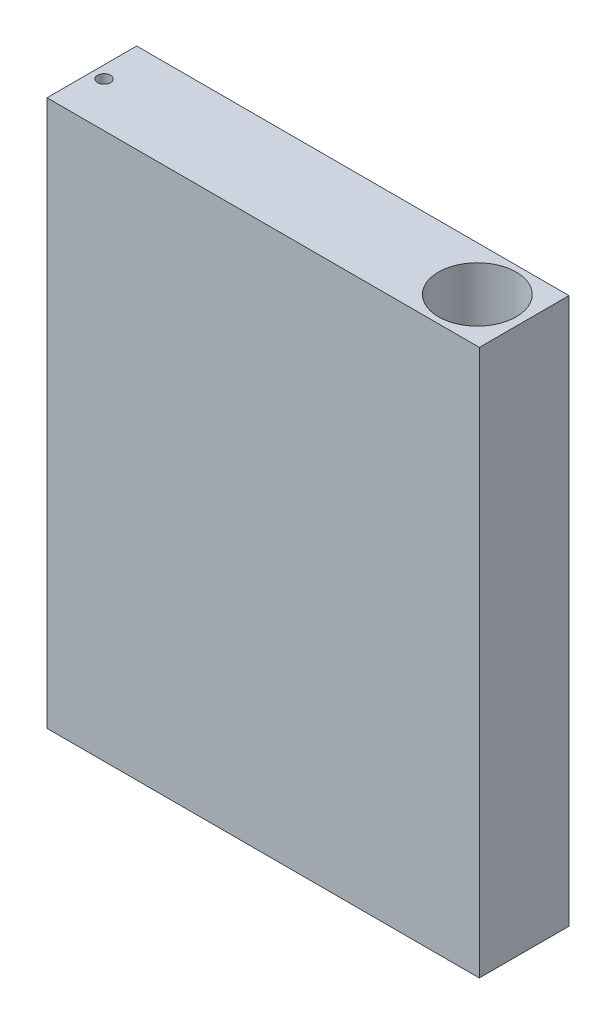
ISO-10303-21;
HEADER;
FILE_DESCRIPTION(('STEP AP214'),'2;1');
FILE_NAME('part.step','',(''),(''),'','','');
FILE_SCHEMA(('AUTOMOTIVE_DESIGN { 1 0 10303 214 1 1 1 1 }'));
ENDSEC;
DATA;
#1=APPLICATION_CONTEXT('core data for automotive mechanical design processes');
#2=APPLICATION_PROTOCOL_DEFINITION('international standard','automotive_design',2000,#1);
#3=PRODUCT_CONTEXT('',#1,'mechanical');
#4=PRODUCT('Part','Part','',(#3));
#5=PRODUCT_RELATED_PRODUCT_CATEGORY('part','',(#4));
#6=PRODUCT_DEFINITION_FORMATION('','',#4);
#7=PRODUCT_DEFINITION_CONTEXT('part definition',#1,'design');
#8=PRODUCT_DEFINITION('design','',#6,#7);
#9=PRODUCT_DEFINITION_SHAPE('','',#8);
#10=(LENGTH_UNIT() NAMED_UNIT(*) SI_UNIT(.MILLI.,.METRE.));
#11=(NAMED_UNIT(*) PLANE_ANGLE_UNIT() SI_UNIT($,.RADIAN.));
#12=(NAMED_UNIT(*) SI_UNIT($,.STERADIAN.) SOLID_ANGLE_UNIT());
#13=UNCERTAINTY_MEASURE_WITH_UNIT(LENGTH_MEASURE(1.E-05),#10,'distance_accuracy_value','');
#14=(GEOMETRIC_REPRESENTATION_CONTEXT(3) GLOBAL_UNCERTAINTY_ASSIGNED_CONTEXT((#13)) GLOBAL_UNIT_ASSIGNED_CONTEXT((#10,
#11,#12)) REPRESENTATION_CONTEXT('',''));
#15=CARTESIAN_POINT('',(0.,0.,0.));
#16=DIRECTION('',(0.,0.,1.));
#17=DIRECTION('',(1.,0.,0.));
#18=AXIS2_PLACEMENT_3D('',#15,#16,#17);
#19=CARTESIAN_POINT('',(0.,67.,0.));
#20=DIRECTION('',(1.,0.,0.));
#21=DIRECTION('',(0.,0.,-1.));
#22=AXIS2_PLACEMENT_3D('',#19,#20,#21);
#23=PLANE('',#22);
#24=DIRECTION('',(0.,0.,1.));
#25=VECTOR('',#24,1.);
#26=CARTESIAN_POINT('',(0.,0.,0.));
#27=LINE('',#26,#25);
#28=CARTESIAN_POINT('',(0.,0.,-11.));
#29=VERTEX_POINT('',#28);
#30=CARTESIAN_POINT('',(0.,0.,0.));
#31=VERTEX_POINT('',#30);
#32=EDGE_CURVE('E97',#29,#31,#27,.T.);
#33=ORIENTED_EDGE('',*,*,#32,.T.);
#34=DIRECTION('',(0.,-1.,0.));
#35=VECTOR('',#34,1.);
#36=CARTESIAN_POINT('',(0.,67.,0.));
#37=LINE('',#36,#35);
#38=CARTESIAN_POINT('',(0.,67.,0.));
#39=VERTEX_POINT('',#38);
#40=EDGE_CURVE('E11',#39,#31,#37,.T.);
#41=ORIENTED_EDGE('',*,*,#40,.F.);
#42=DIRECTION('',(0.,0.,1.));
#43=VECTOR('',#42,1.);
#44=CARTESIAN_POINT('',(0.,67.,0.));
#45=LINE('',#44,#43);
#46=CARTESIAN_POINT('',(0.,67.,-11.));
#47=VERTEX_POINT('',#46);
#48=EDGE_CURVE('E85',#47,#39,#45,.T.);
#49=ORIENTED_EDGE('',*,*,#48,.F.);
#50=DIRECTION('',(0.,-1.,0.));
#51=VECTOR('',#50,1.);
#52=CARTESIAN_POINT('',(0.,67.,-11.));
#53=LINE('',#52,#51);
#54=EDGE_CURVE('E93',#47,#29,#53,.T.);
#55=ORIENTED_EDGE('',*,*,#54,.T.);
#56=EDGE_LOOP('',(#33,#41,#49,#55));
#57=FACE_BOUND('',#56,.T.);
#58=ADVANCED_FACE('F34',(#57),#23,.F.);
#59=CARTESIAN_POINT('',(0.,67.,0.));
#60=DIRECTION('',(0.,0.,-1.));
#61=DIRECTION('',(-1.,0.,0.));
#62=AXIS2_PLACEMENT_3D('',#59,#60,#61);
#63=PLANE('',#62);
#64=DIRECTION('',(1.,0.,0.));
#65=VECTOR('',#64,1.);
#66=CARTESIAN_POINT('',(0.,0.,0.));
#67=LINE('',#66,#65);
#68=CARTESIAN_POINT('',(53.04,0.,0.));
#69=VERTEX_POINT('',#68);
#70=EDGE_CURVE('E89',#31,#69,#67,.T.);
#71=ORIENTED_EDGE('',*,*,#70,.T.);
#72=DIRECTION('',(0.,-1.,0.));
#73=VECTOR('',#72,1.);
#74=CARTESIAN_POINT('',(53.04,67.,0.));
#75=LINE('',#74,#73);
#76=CARTESIAN_POINT('',(53.04,67.,0.));
#77=VERTEX_POINT('',#76);
#78=EDGE_CURVE('E42',#77,#69,#75,.T.);
#79=ORIENTED_EDGE('',*,*,#78,.F.);
#80=DIRECTION('',(1.,0.,0.));
#81=VECTOR('',#80,1.);
#82=CARTESIAN_POINT('',(0.,67.,0.));
#83=LINE('',#82,#81);
#84=EDGE_CURVE('E80',#39,#77,#83,.T.);
#85=ORIENTED_EDGE('',*,*,#84,.F.);
#86=ORIENTED_EDGE('',*,*,#40,.T.);
#87=EDGE_LOOP('',(#71,#79,#85,#86));
#88=FACE_BOUND('',#87,.T.);
#89=ADVANCED_FACE('F88',(#88),#63,.F.);
#90=CARTESIAN_POINT('',(53.04,67.,0.));
#91=DIRECTION('',(-1.,0.,0.));
#92=DIRECTION('',(0.,0.,1.));
#93=AXIS2_PLACEMENT_3D('',#90,#91,#92);
#94=PLANE('',#93);
#95=DIRECTION('',(0.,0.,-1.));
#96=VECTOR('',#95,1.);
#97=CARTESIAN_POINT('',(53.04,0.,0.));
#98=LINE('',#97,#96);
#99=CARTESIAN_POINT('',(53.04,0.,-11.));
#100=VERTEX_POINT('',#99);
#101=EDGE_CURVE('E67',#69,#100,#98,.T.);
#102=ORIENTED_EDGE('',*,*,#101,.T.);
#103=DIRECTION('',(0.,-1.,0.));
#104=VECTOR('',#103,1.);
#105=CARTESIAN_POINT('',(53.04,67.,-11.));
#106=LINE('',#105,#104);
#107=CARTESIAN_POINT('',(53.04,67.,-11.));
#108=VERTEX_POINT('',#107);
#109=EDGE_CURVE('E90',#108,#100,#106,.T.);
#110=ORIENTED_EDGE('',*,*,#109,.F.);
#111=DIRECTION('',(0.,0.,-1.));
#112=VECTOR('',#111,1.);
#113=CARTESIAN_POINT('',(53.04,67.,0.));
#114=LINE('',#113,#112);
#115=EDGE_CURVE('E83',#77,#108,#114,.T.);
#116=ORIENTED_EDGE('',*,*,#115,.F.);
#117=ORIENTED_EDGE('',*,*,#78,.T.);
#118=EDGE_LOOP('',(#102,#110,#116,#117));
#119=FACE_BOUND('',#118,.T.);
#120=ADVANCED_FACE('F91',(#119),#94,.F.);
#121=CARTESIAN_POINT('',(0.,67.,-11.));
#122=DIRECTION('',(0.,0.,1.));
#123=DIRECTION('',(1.,0.,0.));
#124=AXIS2_PLACEMENT_3D('',#121,#122,#123);
#125=PLANE('',#124);
#126=DIRECTION('',(-1.,0.,0.));
#127=VECTOR('',#126,1.);
#128=CARTESIAN_POINT('',(0.,0.,-11.));
#129=LINE('',#128,#127);
#130=EDGE_CURVE('E73',#100,#29,#129,.T.);
#131=ORIENTED_EDGE('',*,*,#130,.T.);
#132=ORIENTED_EDGE('',*,*,#54,.F.);
#133=DIRECTION('',(-1.,0.,0.));
#134=VECTOR('',#133,1.);
#135=CARTESIAN_POINT('',(0.,67.,-11.));
#136=LINE('',#135,#134);
#137=EDGE_CURVE('E50',#108,#47,#136,.T.);
#138=ORIENTED_EDGE('',*,*,#137,.F.);
#139=ORIENTED_EDGE('',*,*,#109,.T.);
#140=EDGE_LOOP('',(#131,#132,#138,#139));
#141=FACE_BOUND('',#140,.T.);
#142=ADVANCED_FACE('F105',(#141),#125,.F.);
#143=CARTESIAN_POINT('',(0.,67.,0.));
#144=DIRECTION('',(0.,-1.,0.));
#145=DIRECTION('',(0.,0.,-1.));
#146=AXIS2_PLACEMENT_3D('',#143,#144,#145);
#147=PLANE('',#146);
#148=CARTESIAN_POINT('',(1.50000000000001,67.,-5.5));
#149=DIRECTION('',(0.,1.,0.));
#150=DIRECTION('',(0.,0.,1.));
#151=AXIS2_PLACEMENT_3D('',#148,#149,#150);
#152=CIRCLE('',#151,0.795);
#153=CARTESIAN_POINT('',(1.50000000000001,67.,-4.705));
#154=VERTEX_POINT('',#153);
#155=EDGE_CURVE('E117',#154,#154,#152,.T.);
#156=ORIENTED_EDGE('',*,*,#155,.F.);
#157=EDGE_LOOP('',(#156));
#158=FACE_BOUND('',#157,.T.);
#159=CARTESIAN_POINT('',(47.29,67.,-5.5));
#160=DIRECTION('',(0.,1.,0.));
#161=DIRECTION('',(0.,0.,1.));
#162=AXIS2_PLACEMENT_3D('',#159,#160,#161);
#163=CIRCLE('',#162,4.765);
#164=CARTESIAN_POINT('',(47.29,67.,-0.735000000000001));
#165=VERTEX_POINT('',#164);
#166=EDGE_CURVE('E111',#165,#165,#163,.T.);
#167=ORIENTED_EDGE('',*,*,#166,.F.);
#168=EDGE_LOOP('',(#167));
#169=FACE_BOUND('',#168,.T.);
#170=ORIENTED_EDGE('',*,*,#48,.T.);
#171=ORIENTED_EDGE('',*,*,#84,.T.);
#172=ORIENTED_EDGE('',*,*,#115,.T.);
#173=ORIENTED_EDGE('',*,*,#137,.T.);
#174=EDGE_LOOP('',(#170,#171,#172,#173));
#175=FACE_BOUND('',#174,.T.);
#176=ADVANCED_FACE('F81',(#158,#169,#175),#147,.F.);
#177=CARTESIAN_POINT('',(0.,0.,0.));
#178=DIRECTION('',(0.,-1.,0.));
#179=DIRECTION('',(0.,0.,-1.));
#180=AXIS2_PLACEMENT_3D('',#177,#178,#179);
#181=PLANE('',#180);
#182=CARTESIAN_POINT('',(47.29,0.,-5.5));
#183=DIRECTION('',(0.,1.,0.));
#184=DIRECTION('',(0.,0.,1.));
#185=AXIS2_PLACEMENT_3D('',#182,#183,#184);
#186=CIRCLE('',#185,4.765);
#187=CARTESIAN_POINT('',(47.29,0.,-0.735000000000001));
#188=VERTEX_POINT('',#187);
#189=EDGE_CURVE('E100',#188,#188,#186,.T.);
#190=ORIENTED_EDGE('',*,*,#189,.T.);
#191=EDGE_LOOP('',(#190));
#192=FACE_BOUND('',#191,.T.);
#193=ORIENTED_EDGE('',*,*,#32,.F.);
#194=ORIENTED_EDGE('',*,*,#130,.F.);
#195=ORIENTED_EDGE('',*,*,#101,.F.);
#196=ORIENTED_EDGE('',*,*,#70,.F.);
#197=EDGE_LOOP('',(#193,#194,#195,#196));
#198=FACE_BOUND('',#197,.T.);
#199=ADVANCED_FACE('F108',(#192,#198),#181,.T.);
#200=CARTESIAN_POINT('',(47.29,0.,-5.5));
#201=DIRECTION('',(0.,1.,0.));
#202=DIRECTION('',(0.,0.,1.));
#203=AXIS2_PLACEMENT_3D('',#200,#201,#202);
#204=CYLINDRICAL_SURFACE('',#203,4.765);
#205=ORIENTED_EDGE('',*,*,#189,.F.);
#206=EDGE_LOOP('',(#205));
#207=FACE_BOUND('',#206,.T.);
#208=ORIENTED_EDGE('',*,*,#166,.T.);
#209=EDGE_LOOP('',(#208));
#210=FACE_BOUND('',#209,.T.);
#211=ADVANCED_FACE('F128',(#207,#210),#204,.F.);
#212=CARTESIAN_POINT('',(1.50000000000001,33.5,-5.5));
#213=DIRECTION('',(0.,1.,0.));
#214=DIRECTION('',(0.,0.,1.));
#215=AXIS2_PLACEMENT_3D('',#212,#213,#214);
#216=CYLINDRICAL_SURFACE('',#215,0.795);
#217=CARTESIAN_POINT('',(1.50000000000001,33.5,-5.5));
#218=DIRECTION('',(0.,1.,0.));
#219=DIRECTION('',(0.,0.,1.));
#220=AXIS2_PLACEMENT_3D('',#217,#218,#219);
#221=CIRCLE('',#220,0.795);
#222=CARTESIAN_POINT('',(1.50000000000001,33.5,-4.705));
#223=VERTEX_POINT('',#222);
#224=EDGE_CURVE('E114',#223,#223,#221,.T.);
#225=ORIENTED_EDGE('',*,*,#224,.F.);
#226=EDGE_LOOP('',(#225));
#227=FACE_BOUND('',#226,.T.);
#228=ORIENTED_EDGE('',*,*,#155,.T.);
#229=EDGE_LOOP('',(#228));
#230=FACE_BOUND('',#229,.T.);
#231=ADVANCED_FACE('F125',(#227,#230),#216,.F.);
#232=CARTESIAN_POINT('',(1.50000000000001,33.5,-5.5));
#233=DIRECTION('',(0.,1.,0.));
#234=DIRECTION('',(0.,0.,1.));
#235=AXIS2_PLACEMENT_3D('',#232,#233,#234);
#236=PLANE('',#235);
#237=ORIENTED_EDGE('',*,*,#224,.T.);
#238=EDGE_LOOP('',(#237));
#239=FACE_BOUND('',#238,.T.);
#240=ADVANCED_FACE('F123',(#239),#236,.T.);
#241=CLOSED_SHELL('',(#58,#89,#120,#142,#176,#199,#211,#231,#240));
#242=MANIFOLD_SOLID_BREP('B2',#241);
#243=ADVANCED_BREP_SHAPE_REPRESENTATION('',(#18,#242),#14);
#244=SHAPE_DEFINITION_REPRESENTATION(#9,#243);
ENDSEC;
END-ISO-10303-21;
